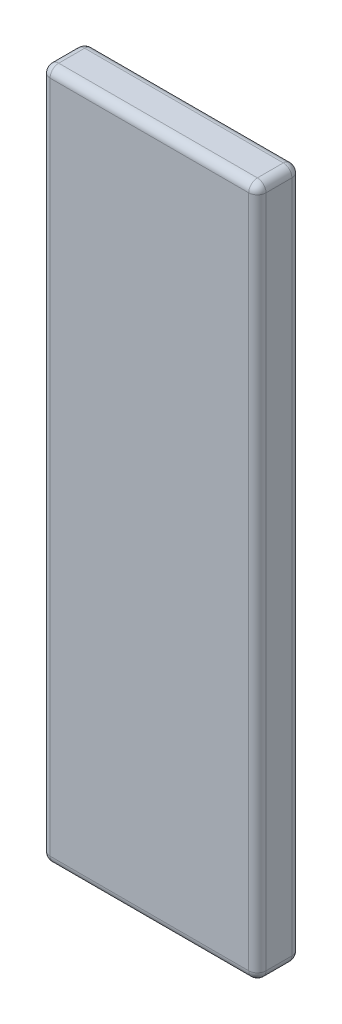
ISO-10303-21;
HEADER;
FILE_DESCRIPTION(('STEP AP214'),'2;1');
FILE_NAME('part.step','',(''),(''),'','','');
FILE_SCHEMA(('AUTOMOTIVE_DESIGN { 1 0 10303 214 1 1 1 1 }'));
ENDSEC;
DATA;
#1=APPLICATION_CONTEXT('core data for automotive mechanical design processes');
#2=APPLICATION_PROTOCOL_DEFINITION('international standard','automotive_design',2000,#1);
#3=PRODUCT_CONTEXT('',#1,'mechanical');
#4=PRODUCT('Part','Part','',(#3));
#5=PRODUCT_RELATED_PRODUCT_CATEGORY('part','',(#4));
#6=PRODUCT_DEFINITION_FORMATION('','',#4);
#7=PRODUCT_DEFINITION_CONTEXT('part definition',#1,'design');
#8=PRODUCT_DEFINITION('design','',#6,#7);
#9=PRODUCT_DEFINITION_SHAPE('','',#8);
#10=(LENGTH_UNIT() NAMED_UNIT(*) SI_UNIT(.MILLI.,.METRE.));
#11=(NAMED_UNIT(*) PLANE_ANGLE_UNIT() SI_UNIT($,.RADIAN.));
#12=(NAMED_UNIT(*) SI_UNIT($,.STERADIAN.) SOLID_ANGLE_UNIT());
#13=UNCERTAINTY_MEASURE_WITH_UNIT(LENGTH_MEASURE(1.E-05),#10,'distance_accuracy_value','');
#14=(GEOMETRIC_REPRESENTATION_CONTEXT(3) GLOBAL_UNCERTAINTY_ASSIGNED_CONTEXT((#13)) GLOBAL_UNIT_ASSIGNED_CONTEXT((#10,
#11,#12)) REPRESENTATION_CONTEXT('',''));
#15=CARTESIAN_POINT('',(0.,0.,0.));
#16=DIRECTION('',(0.,0.,1.));
#17=DIRECTION('',(1.,0.,0.));
#18=AXIS2_PLACEMENT_3D('',#15,#16,#17);
#19=CARTESIAN_POINT('',(1.25,-4.,0.5));
#20=DIRECTION('',(-1.,0.,0.));
#21=DIRECTION('',(0.,0.,1.));
#22=AXIS2_PLACEMENT_3D('',#19,#20,#21);
#23=PLANE('',#22);
#24=DIRECTION('',(0.,1.,0.));
#25=VECTOR('',#24,1.);
#26=CARTESIAN_POINT('',(1.25,-4.,0.4));
#27=LINE('',#26,#25);
#28=CARTESIAN_POINT('',(1.25,3.9,0.4));
#29=VERTEX_POINT('',#28);
#30=CARTESIAN_POINT('',(1.25,-3.9,0.4));
#31=VERTEX_POINT('',#30);
#32=EDGE_CURVE('E187',#29,#31,#27,.F.);
#33=ORIENTED_EDGE('',*,*,#32,.T.);
#34=DIRECTION('',(0.,0.,-1.));
#35=VECTOR('',#34,1.);
#36=CARTESIAN_POINT('',(1.25,-3.9,0.5));
#37=LINE('',#36,#35);
#38=CARTESIAN_POINT('',(1.25,-3.9,0.1));
#39=VERTEX_POINT('',#38);
#40=EDGE_CURVE('E189',#31,#39,#37,.T.);
#41=ORIENTED_EDGE('',*,*,#40,.T.);
#42=DIRECTION('',(0.,1.,0.));
#43=VECTOR('',#42,1.);
#44=CARTESIAN_POINT('',(1.25,4.,0.1));
#45=LINE('',#44,#43);
#46=CARTESIAN_POINT('',(1.25,3.9,0.1));
#47=VERTEX_POINT('',#46);
#48=EDGE_CURVE('E183',#39,#47,#45,.T.);
#49=ORIENTED_EDGE('',*,*,#48,.T.);
#50=DIRECTION('',(0.,0.,-1.));
#51=VECTOR('',#50,1.);
#52=CARTESIAN_POINT('',(1.25,3.9,0.5));
#53=LINE('',#52,#51);
#54=EDGE_CURVE('E185',#47,#29,#53,.F.);
#55=ORIENTED_EDGE('',*,*,#54,.T.);
#56=EDGE_LOOP('',(#33,#41,#49,#55));
#57=FACE_BOUND('',#56,.T.);
#58=ADVANCED_FACE('F32',(#57),#23,.F.);
#59=CARTESIAN_POINT('',(-1.25,4.,0.5));
#60=DIRECTION('',(0.,-1.,0.));
#61=DIRECTION('',(0.,0.,-1.));
#62=AXIS2_PLACEMENT_3D('',#59,#60,#61);
#63=PLANE('',#62);
#64=DIRECTION('',(0.,0.,-1.));
#65=VECTOR('',#64,1.);
#66=CARTESIAN_POINT('',(-1.15,4.,0.5));
#67=LINE('',#66,#65);
#68=CARTESIAN_POINT('',(-1.15,4.,0.1));
#69=VERTEX_POINT('',#68);
#70=CARTESIAN_POINT('',(-1.15,4.,0.4));
#71=VERTEX_POINT('',#70);
#72=EDGE_CURVE('E178',#69,#71,#67,.F.);
#73=ORIENTED_EDGE('',*,*,#72,.T.);
#74=DIRECTION('',(-1.,0.,0.));
#75=VECTOR('',#74,1.);
#76=CARTESIAN_POINT('',(-1.25,4.,0.4));
#77=LINE('',#76,#75);
#78=CARTESIAN_POINT('',(1.15,4.,0.4));
#79=VERTEX_POINT('',#78);
#80=EDGE_CURVE('E180',#71,#79,#77,.F.);
#81=ORIENTED_EDGE('',*,*,#80,.T.);
#82=DIRECTION('',(0.,0.,-1.));
#83=VECTOR('',#82,1.);
#84=CARTESIAN_POINT('',(1.15,4.,0.5));
#85=LINE('',#84,#83);
#86=CARTESIAN_POINT('',(1.15,4.,0.1));
#87=VERTEX_POINT('',#86);
#88=EDGE_CURVE('E176',#79,#87,#85,.T.);
#89=ORIENTED_EDGE('',*,*,#88,.T.);
#90=DIRECTION('',(-1.,0.,0.));
#91=VECTOR('',#90,1.);
#92=CARTESIAN_POINT('',(-1.25,4.,0.1));
#93=LINE('',#92,#91);
#94=EDGE_CURVE('E174',#87,#69,#93,.T.);
#95=ORIENTED_EDGE('',*,*,#94,.T.);
#96=EDGE_LOOP('',(#73,#81,#89,#95));
#97=FACE_BOUND('',#96,.T.);
#98=ADVANCED_FACE('F264',(#97),#63,.F.);
#99=CARTESIAN_POINT('',(-1.25,-4.,0.5));
#100=DIRECTION('',(1.,0.,0.));
#101=DIRECTION('',(0.,0.,-1.));
#102=AXIS2_PLACEMENT_3D('',#99,#100,#101);
#103=PLANE('',#102);
#104=DIRECTION('',(0.,-1.,0.));
#105=VECTOR('',#104,1.);
#106=CARTESIAN_POINT('',(-1.25,-4.,0.1));
#107=LINE('',#106,#105);
#108=CARTESIAN_POINT('',(-1.25,3.9,0.1));
#109=VERTEX_POINT('',#108);
#110=CARTESIAN_POINT('',(-1.25,-3.9,0.1));
#111=VERTEX_POINT('',#110);
#112=EDGE_CURVE('E154',#109,#111,#107,.T.);
#113=ORIENTED_EDGE('',*,*,#112,.T.);
#114=DIRECTION('',(0.,0.,-1.));
#115=VECTOR('',#114,1.);
#116=CARTESIAN_POINT('',(-1.25,-3.9,0.5));
#117=LINE('',#116,#115);
#118=CARTESIAN_POINT('',(-1.25,-3.9,0.4));
#119=VERTEX_POINT('',#118);
#120=EDGE_CURVE('E127',#111,#119,#117,.F.);
#121=ORIENTED_EDGE('',*,*,#120,.T.);
#122=DIRECTION('',(0.,-1.,0.));
#123=VECTOR('',#122,1.);
#124=CARTESIAN_POINT('',(-1.25,-4.,0.4));
#125=LINE('',#124,#123);
#126=CARTESIAN_POINT('',(-1.25,3.9,0.4));
#127=VERTEX_POINT('',#126);
#128=EDGE_CURVE('E162',#119,#127,#125,.F.);
#129=ORIENTED_EDGE('',*,*,#128,.T.);
#130=DIRECTION('',(0.,0.,-1.));
#131=VECTOR('',#130,1.);
#132=CARTESIAN_POINT('',(-1.25,3.9,0.5));
#133=LINE('',#132,#131);
#134=EDGE_CURVE('E156',#127,#109,#133,.T.);
#135=ORIENTED_EDGE('',*,*,#134,.T.);
#136=EDGE_LOOP('',(#113,#121,#129,#135));
#137=FACE_BOUND('',#136,.T.);
#138=ADVANCED_FACE('F325',(#137),#103,.F.);
#139=CARTESIAN_POINT('',(-1.25,-4.,0.5));
#140=DIRECTION('',(0.,1.,0.));
#141=DIRECTION('',(0.,0.,1.));
#142=AXIS2_PLACEMENT_3D('',#139,#140,#141);
#143=PLANE('',#142);
#144=DIRECTION('',(1.,0.,0.));
#145=VECTOR('',#144,1.);
#146=CARTESIAN_POINT('',(-1.25,-4.,0.4));
#147=LINE('',#146,#145);
#148=CARTESIAN_POINT('',(1.15,-4.,0.4));
#149=VERTEX_POINT('',#148);
#150=CARTESIAN_POINT('',(-1.15,-4.,0.4));
#151=VERTEX_POINT('',#150);
#152=EDGE_CURVE('E152',#149,#151,#147,.F.);
#153=ORIENTED_EDGE('',*,*,#152,.T.);
#154=DIRECTION('',(0.,0.,-1.));
#155=VECTOR('',#154,1.);
#156=CARTESIAN_POINT('',(-1.15,-4.,0.5));
#157=LINE('',#156,#155);
#158=CARTESIAN_POINT('',(-1.15,-4.,0.1));
#159=VERTEX_POINT('',#158);
#160=EDGE_CURVE('E125',#151,#159,#157,.T.);
#161=ORIENTED_EDGE('',*,*,#160,.T.);
#162=DIRECTION('',(1.,0.,0.));
#163=VECTOR('',#162,1.);
#164=CARTESIAN_POINT('',(1.25,-4.,0.1));
#165=LINE('',#164,#163);
#166=CARTESIAN_POINT('',(1.15,-4.,0.1));
#167=VERTEX_POINT('',#166);
#168=EDGE_CURVE('E142',#159,#167,#165,.T.);
#169=ORIENTED_EDGE('',*,*,#168,.T.);
#170=DIRECTION('',(0.,0.,-1.));
#171=VECTOR('',#170,1.);
#172=CARTESIAN_POINT('',(1.15,-4.,0.5));
#173=LINE('',#172,#171);
#174=EDGE_CURVE('E148',#167,#149,#173,.F.);
#175=ORIENTED_EDGE('',*,*,#174,.T.);
#176=EDGE_LOOP('',(#153,#161,#169,#175));
#177=FACE_BOUND('',#176,.T.);
#178=ADVANCED_FACE('F150',(#177),#143,.F.);
#179=CARTESIAN_POINT('',(0.,0.,0.5));
#180=DIRECTION('',(0.,0.,-1.));
#181=DIRECTION('',(-1.,0.,0.));
#182=AXIS2_PLACEMENT_3D('',#179,#180,#181);
#183=PLANE('',#182);
#184=DIRECTION('',(0.,-1.,0.));
#185=VECTOR('',#184,1.);
#186=CARTESIAN_POINT('',(-1.15,0.,0.5));
#187=LINE('',#186,#185);
#188=CARTESIAN_POINT('',(-1.15,3.9,0.5));
#189=VERTEX_POINT('',#188);
#190=CARTESIAN_POINT('',(-1.15,-3.9,0.5));
#191=VERTEX_POINT('',#190);
#192=EDGE_CURVE('E169',#189,#191,#187,.T.);
#193=ORIENTED_EDGE('',*,*,#192,.T.);
#194=DIRECTION('',(1.,0.,0.));
#195=VECTOR('',#194,1.);
#196=CARTESIAN_POINT('',(0.,-3.9,0.5));
#197=LINE('',#196,#195);
#198=CARTESIAN_POINT('',(1.15,-3.9,0.5));
#199=VERTEX_POINT('',#198);
#200=EDGE_CURVE('E171',#191,#199,#197,.T.);
#201=ORIENTED_EDGE('',*,*,#200,.T.);
#202=DIRECTION('',(0.,1.,0.));
#203=VECTOR('',#202,1.);
#204=CARTESIAN_POINT('',(1.15,0.,0.5));
#205=LINE('',#204,#203);
#206=CARTESIAN_POINT('',(1.15,3.9,0.5));
#207=VERTEX_POINT('',#206);
#208=EDGE_CURVE('E165',#199,#207,#205,.T.);
#209=ORIENTED_EDGE('',*,*,#208,.T.);
#210=DIRECTION('',(-1.,0.,0.));
#211=VECTOR('',#210,1.);
#212=CARTESIAN_POINT('',(0.,3.9,0.5));
#213=LINE('',#212,#211);
#214=EDGE_CURVE('E167',#207,#189,#213,.T.);
#215=ORIENTED_EDGE('',*,*,#214,.T.);
#216=EDGE_LOOP('',(#193,#201,#209,#215));
#217=FACE_BOUND('',#216,.T.);
#218=ADVANCED_FACE('F285',(#217),#183,.F.);
#219=CARTESIAN_POINT('',(0.,0.,0.));
#220=DIRECTION('',(0.,0.,-1.));
#221=DIRECTION('',(-1.,0.,0.));
#222=AXIS2_PLACEMENT_3D('',#219,#220,#221);
#223=PLANE('',#222);
#224=DIRECTION('',(0.,-1.,0.));
#225=VECTOR('',#224,1.);
#226=CARTESIAN_POINT('',(-1.15,4.,0.));
#227=LINE('',#226,#225);
#228=CARTESIAN_POINT('',(-1.15,-3.9,0.));
#229=VERTEX_POINT('',#228);
#230=CARTESIAN_POINT('',(-1.15,3.9,0.));
#231=VERTEX_POINT('',#230);
#232=EDGE_CURVE('E41',#229,#231,#227,.F.);
#233=ORIENTED_EDGE('',*,*,#232,.T.);
#234=DIRECTION('',(-1.,0.,0.));
#235=VECTOR('',#234,1.);
#236=CARTESIAN_POINT('',(1.25,3.9,0.));
#237=LINE('',#236,#235);
#238=CARTESIAN_POINT('',(1.15,3.9,0.));
#239=VERTEX_POINT('',#238);
#240=EDGE_CURVE('E11',#231,#239,#237,.F.);
#241=ORIENTED_EDGE('',*,*,#240,.T.);
#242=DIRECTION('',(0.,1.,0.));
#243=VECTOR('',#242,1.);
#244=CARTESIAN_POINT('',(1.15,-4.,0.));
#245=LINE('',#244,#243);
#246=CARTESIAN_POINT('',(1.15,-3.9,0.));
#247=VERTEX_POINT('',#246);
#248=EDGE_CURVE('E192',#239,#247,#245,.F.);
#249=ORIENTED_EDGE('',*,*,#248,.T.);
#250=DIRECTION('',(1.,0.,0.));
#251=VECTOR('',#250,1.);
#252=CARTESIAN_POINT('',(-1.25,-3.9,0.));
#253=LINE('',#252,#251);
#254=EDGE_CURVE('E52',#247,#229,#253,.F.);
#255=ORIENTED_EDGE('',*,*,#254,.T.);
#256=EDGE_LOOP('',(#233,#241,#249,#255));
#257=FACE_BOUND('',#256,.T.);
#258=ADVANCED_FACE('F311',(#257),#223,.T.);
#259=CARTESIAN_POINT('',(1.15,3.9,0.5));
#260=DIRECTION('',(0.,0.,-1.));
#261=DIRECTION('',(-1.,0.,0.));
#262=AXIS2_PLACEMENT_3D('',#259,#260,#261);
#263=CYLINDRICAL_SURFACE('',#262,0.1);
#264=CARTESIAN_POINT('',(1.15,3.9,0.4));
#265=DIRECTION('',(0.,0.,1.));
#266=DIRECTION('',(1.,0.,0.));
#267=AXIS2_PLACEMENT_3D('',#264,#265,#266);
#268=CIRCLE('',#267,0.1);
#269=EDGE_CURVE('E36',#29,#79,#268,.T.);
#270=ORIENTED_EDGE('',*,*,#269,.F.);
#271=ORIENTED_EDGE('',*,*,#54,.F.);
#272=CARTESIAN_POINT('',(1.15,3.9,0.1));
#273=DIRECTION('',(0.,0.,-1.));
#274=DIRECTION('',(-1.,0.,0.));
#275=AXIS2_PLACEMENT_3D('',#272,#273,#274);
#276=CIRCLE('',#275,0.1);
#277=EDGE_CURVE('E245',#87,#47,#276,.T.);
#278=ORIENTED_EDGE('',*,*,#277,.F.);
#279=ORIENTED_EDGE('',*,*,#88,.F.);
#280=EDGE_LOOP('',(#270,#271,#278,#279));
#281=FACE_BOUND('',#280,.T.);
#282=ADVANCED_FACE('F34',(#281),#263,.T.);
#283=CARTESIAN_POINT('',(1.15,3.9,0.4));
#284=DIRECTION('',(0.,0.,1.));
#285=DIRECTION('',(1.,0.,0.));
#286=AXIS2_PLACEMENT_3D('',#283,#284,#285);
#287=SPHERICAL_SURFACE('',#286,0.1);
#288=CARTESIAN_POINT('',(1.15,3.9,0.4));
#289=DIRECTION('',(0.,1.,0.));
#290=DIRECTION('',(0.,0.,1.));
#291=AXIS2_PLACEMENT_3D('',#288,#289,#290);
#292=CIRCLE('',#291,0.1);
#293=EDGE_CURVE('E241',#29,#207,#292,.F.);
#294=ORIENTED_EDGE('',*,*,#293,.F.);
#295=ORIENTED_EDGE('',*,*,#269,.T.);
#296=CARTESIAN_POINT('',(1.15,3.9,0.4));
#297=DIRECTION('',(1.,0.,0.));
#298=DIRECTION('',(0.,0.,-1.));
#299=AXIS2_PLACEMENT_3D('',#296,#297,#298);
#300=CIRCLE('',#299,0.1);
#301=EDGE_CURVE('E244',#207,#79,#300,.F.);
#302=ORIENTED_EDGE('',*,*,#301,.F.);
#303=EDGE_LOOP('',(#294,#295,#302));
#304=FACE_BOUND('',#303,.T.);
#305=ADVANCED_FACE('F257',(#304),#287,.T.);
#306=CARTESIAN_POINT('',(1.15,3.9,0.1));
#307=DIRECTION('',(0.,0.,1.));
#308=DIRECTION('',(1.,0.,0.));
#309=AXIS2_PLACEMENT_3D('',#306,#307,#308);
#310=SPHERICAL_SURFACE('',#309,0.1);
#311=CARTESIAN_POINT('',(1.15,3.9,0.1));
#312=DIRECTION('',(1.,0.,0.));
#313=DIRECTION('',(0.,1.,0.));
#314=AXIS2_PLACEMENT_3D('',#311,#312,#313);
#315=CIRCLE('',#314,0.1);
#316=EDGE_CURVE('E235',#87,#239,#315,.F.);
#317=ORIENTED_EDGE('',*,*,#316,.F.);
#318=ORIENTED_EDGE('',*,*,#277,.T.);
#319=CARTESIAN_POINT('',(1.15,3.9,0.1));
#320=DIRECTION('',(0.,1.,0.));
#321=DIRECTION('',(0.,0.,1.));
#322=AXIS2_PLACEMENT_3D('',#319,#320,#321);
#323=CIRCLE('',#322,0.1);
#324=EDGE_CURVE('E238',#239,#47,#323,.F.);
#325=ORIENTED_EDGE('',*,*,#324,.F.);
#326=EDGE_LOOP('',(#317,#318,#325));
#327=FACE_BOUND('',#326,.T.);
#328=ADVANCED_FACE('F307',(#327),#310,.T.);
#329=CARTESIAN_POINT('',(0.,3.9,0.4));
#330=DIRECTION('',(-1.,0.,0.));
#331=DIRECTION('',(0.,0.,1.));
#332=AXIS2_PLACEMENT_3D('',#329,#330,#331);
#333=CYLINDRICAL_SURFACE('',#332,0.1);
#334=ORIENTED_EDGE('',*,*,#301,.T.);
#335=ORIENTED_EDGE('',*,*,#80,.F.);
#336=CARTESIAN_POINT('',(-1.15,3.9,0.4));
#337=DIRECTION('',(-1.,0.,0.));
#338=DIRECTION('',(0.,0.,1.));
#339=AXIS2_PLACEMENT_3D('',#336,#337,#338);
#340=CIRCLE('',#339,0.1);
#341=EDGE_CURVE('E229',#189,#71,#340,.T.);
#342=ORIENTED_EDGE('',*,*,#341,.F.);
#343=ORIENTED_EDGE('',*,*,#214,.F.);
#344=EDGE_LOOP('',(#334,#335,#342,#343));
#345=FACE_BOUND('',#344,.T.);
#346=ADVANCED_FACE('F269',(#345),#333,.T.);
#347=CARTESIAN_POINT('',(1.15,0.,0.4));
#348=DIRECTION('',(0.,1.,0.));
#349=DIRECTION('',(0.,0.,1.));
#350=AXIS2_PLACEMENT_3D('',#347,#348,#349);
#351=CYLINDRICAL_SURFACE('',#350,0.1);
#352=ORIENTED_EDGE('',*,*,#293,.T.);
#353=ORIENTED_EDGE('',*,*,#208,.F.);
#354=CARTESIAN_POINT('',(1.15,-3.9,0.4));
#355=DIRECTION('',(0.,-1.,0.));
#356=DIRECTION('',(0.,0.,-1.));
#357=AXIS2_PLACEMENT_3D('',#354,#355,#356);
#358=CIRCLE('',#357,0.1);
#359=EDGE_CURVE('E226',#31,#199,#358,.T.);
#360=ORIENTED_EDGE('',*,*,#359,.F.);
#361=ORIENTED_EDGE('',*,*,#32,.F.);
#362=EDGE_LOOP('',(#352,#353,#360,#361));
#363=FACE_BOUND('',#362,.T.);
#364=ADVANCED_FACE('F296',(#363),#351,.T.);
#365=CARTESIAN_POINT('',(1.15,-3.9,0.5));
#366=DIRECTION('',(0.,0.,-1.));
#367=DIRECTION('',(-1.,0.,0.));
#368=AXIS2_PLACEMENT_3D('',#365,#366,#367);
#369=CYLINDRICAL_SURFACE('',#368,0.1);
#370=CARTESIAN_POINT('',(1.15,-3.9,0.1));
#371=DIRECTION('',(0.,0.,-1.));
#372=DIRECTION('',(-1.,0.,0.));
#373=AXIS2_PLACEMENT_3D('',#370,#371,#372);
#374=CIRCLE('',#373,0.1);
#375=EDGE_CURVE('E220',#39,#167,#374,.T.);
#376=ORIENTED_EDGE('',*,*,#375,.F.);
#377=ORIENTED_EDGE('',*,*,#40,.F.);
#378=CARTESIAN_POINT('',(1.15,-3.9,0.4));
#379=DIRECTION('',(0.,0.,1.));
#380=DIRECTION('',(1.,0.,0.));
#381=AXIS2_PLACEMENT_3D('',#378,#379,#380);
#382=CIRCLE('',#381,0.1);
#383=EDGE_CURVE('E223',#149,#31,#382,.T.);
#384=ORIENTED_EDGE('',*,*,#383,.F.);
#385=ORIENTED_EDGE('',*,*,#174,.F.);
#386=EDGE_LOOP('',(#376,#377,#384,#385));
#387=FACE_BOUND('',#386,.T.);
#388=ADVANCED_FACE('F301',(#387),#369,.T.);
#389=CARTESIAN_POINT('',(1.15,-4.,0.1));
#390=DIRECTION('',(0.,-1.,0.));
#391=DIRECTION('',(0.,0.,-1.));
#392=AXIS2_PLACEMENT_3D('',#389,#390,#391);
#393=CYLINDRICAL_SURFACE('',#392,0.1);
#394=ORIENTED_EDGE('',*,*,#324,.T.);
#395=ORIENTED_EDGE('',*,*,#48,.F.);
#396=CARTESIAN_POINT('',(1.15,-3.9,0.1));
#397=DIRECTION('',(0.,-1.,0.));
#398=DIRECTION('',(0.,0.,-1.));
#399=AXIS2_PLACEMENT_3D('',#396,#397,#398);
#400=CIRCLE('',#399,0.1);
#401=EDGE_CURVE('E218',#247,#39,#400,.T.);
#402=ORIENTED_EDGE('',*,*,#401,.F.);
#403=ORIENTED_EDGE('',*,*,#248,.F.);
#404=EDGE_LOOP('',(#394,#395,#402,#403));
#405=FACE_BOUND('',#404,.T.);
#406=ADVANCED_FACE('F306',(#405),#393,.T.);
#407=CARTESIAN_POINT('',(-1.25,3.9,0.1));
#408=DIRECTION('',(1.,0.,0.));
#409=DIRECTION('',(0.,0.,-1.));
#410=AXIS2_PLACEMENT_3D('',#407,#408,#409);
#411=CYLINDRICAL_SURFACE('',#410,0.1);
#412=ORIENTED_EDGE('',*,*,#316,.T.);
#413=ORIENTED_EDGE('',*,*,#240,.F.);
#414=CARTESIAN_POINT('',(-1.15,3.9,0.1));
#415=DIRECTION('',(-1.,0.,0.));
#416=DIRECTION('',(0.,0.,1.));
#417=AXIS2_PLACEMENT_3D('',#414,#415,#416);
#418=CIRCLE('',#417,0.1);
#419=EDGE_CURVE('E215',#69,#231,#418,.T.);
#420=ORIENTED_EDGE('',*,*,#419,.F.);
#421=ORIENTED_EDGE('',*,*,#94,.F.);
#422=EDGE_LOOP('',(#412,#413,#420,#421));
#423=FACE_BOUND('',#422,.T.);
#424=ADVANCED_FACE('F310',(#423),#411,.T.);
#425=CARTESIAN_POINT('',(-1.15,3.9,0.5));
#426=DIRECTION('',(0.,0.,-1.));
#427=DIRECTION('',(-1.,0.,0.));
#428=AXIS2_PLACEMENT_3D('',#425,#426,#427);
#429=CYLINDRICAL_SURFACE('',#428,0.1);
#430=CARTESIAN_POINT('',(-1.15,3.9,0.4));
#431=DIRECTION('',(0.,0.,1.));
#432=DIRECTION('',(1.,0.,0.));
#433=AXIS2_PLACEMENT_3D('',#430,#431,#432);
#434=CIRCLE('',#433,0.1);
#435=EDGE_CURVE('E232',#71,#127,#434,.T.);
#436=ORIENTED_EDGE('',*,*,#435,.F.);
#437=ORIENTED_EDGE('',*,*,#72,.F.);
#438=CARTESIAN_POINT('',(-1.15,3.9,0.1));
#439=DIRECTION('',(0.,0.,-1.));
#440=DIRECTION('',(-1.,0.,0.));
#441=AXIS2_PLACEMENT_3D('',#438,#439,#440);
#442=CIRCLE('',#441,0.1);
#443=EDGE_CURVE('E212',#109,#69,#442,.T.);
#444=ORIENTED_EDGE('',*,*,#443,.F.);
#445=ORIENTED_EDGE('',*,*,#134,.F.);
#446=EDGE_LOOP('',(#436,#437,#444,#445));
#447=FACE_BOUND('',#446,.T.);
#448=ADVANCED_FACE('F273',(#447),#429,.T.);
#449=CARTESIAN_POINT('',(-1.15,3.9,0.4));
#450=DIRECTION('',(0.,0.,1.));
#451=DIRECTION('',(1.,0.,0.));
#452=AXIS2_PLACEMENT_3D('',#449,#450,#451);
#453=SPHERICAL_SURFACE('',#452,0.1);
#454=ORIENTED_EDGE('',*,*,#341,.T.);
#455=ORIENTED_EDGE('',*,*,#435,.T.);
#456=CARTESIAN_POINT('',(-1.15,3.9,0.4));
#457=DIRECTION('',(0.,1.,0.));
#458=DIRECTION('',(0.,0.,1.));
#459=AXIS2_PLACEMENT_3D('',#456,#457,#458);
#460=CIRCLE('',#459,0.1);
#461=EDGE_CURVE('E209',#189,#127,#460,.F.);
#462=ORIENTED_EDGE('',*,*,#461,.F.);
#463=EDGE_LOOP('',(#454,#455,#462));
#464=FACE_BOUND('',#463,.T.);
#465=ADVANCED_FACE('F277',(#464),#453,.T.);
#466=CARTESIAN_POINT('',(1.15,-3.9,0.4));
#467=DIRECTION('',(0.,0.,1.));
#468=DIRECTION('',(1.,0.,0.));
#469=AXIS2_PLACEMENT_3D('',#466,#467,#468);
#470=SPHERICAL_SURFACE('',#469,0.1);
#471=ORIENTED_EDGE('',*,*,#383,.T.);
#472=ORIENTED_EDGE('',*,*,#359,.T.);
#473=CARTESIAN_POINT('',(1.15,-3.9,0.4));
#474=DIRECTION('',(1.,0.,0.));
#475=DIRECTION('',(0.,0.,-1.));
#476=AXIS2_PLACEMENT_3D('',#473,#474,#475);
#477=CIRCLE('',#476,0.1);
#478=EDGE_CURVE('E207',#149,#199,#477,.F.);
#479=ORIENTED_EDGE('',*,*,#478,.F.);
#480=EDGE_LOOP('',(#471,#472,#479));
#481=FACE_BOUND('',#480,.T.);
#482=ADVANCED_FACE('F293',(#481),#470,.T.);
#483=CARTESIAN_POINT('',(1.15,-3.9,0.1));
#484=DIRECTION('',(0.,0.,1.));
#485=DIRECTION('',(1.,0.,0.));
#486=AXIS2_PLACEMENT_3D('',#483,#484,#485);
#487=SPHERICAL_SURFACE('',#486,0.1);
#488=ORIENTED_EDGE('',*,*,#401,.T.);
#489=ORIENTED_EDGE('',*,*,#375,.T.);
#490=CARTESIAN_POINT('',(1.15,-3.9,0.1));
#491=DIRECTION('',(1.,0.,0.));
#492=DIRECTION('',(0.,0.,-1.));
#493=AXIS2_PLACEMENT_3D('',#490,#491,#492);
#494=CIRCLE('',#493,0.1);
#495=EDGE_CURVE('E145',#247,#167,#494,.F.);
#496=ORIENTED_EDGE('',*,*,#495,.F.);
#497=EDGE_LOOP('',(#488,#489,#496));
#498=FACE_BOUND('',#497,.T.);
#499=ADVANCED_FACE('F350',(#498),#487,.T.);
#500=CARTESIAN_POINT('',(-1.15,3.9,0.1));
#501=DIRECTION('',(0.,0.,1.));
#502=DIRECTION('',(1.,0.,0.));
#503=AXIS2_PLACEMENT_3D('',#500,#501,#502);
#504=SPHERICAL_SURFACE('',#503,0.1);
#505=ORIENTED_EDGE('',*,*,#443,.T.);
#506=ORIENTED_EDGE('',*,*,#419,.T.);
#507=CARTESIAN_POINT('',(-1.15,3.9,0.1));
#508=DIRECTION('',(0.,1.,0.));
#509=DIRECTION('',(-1.,0.,0.));
#510=AXIS2_PLACEMENT_3D('',#507,#508,#509);
#511=CIRCLE('',#510,0.1);
#512=EDGE_CURVE('E203',#109,#231,#511,.F.);
#513=ORIENTED_EDGE('',*,*,#512,.F.);
#514=EDGE_LOOP('',(#505,#506,#513));
#515=FACE_BOUND('',#514,.T.);
#516=ADVANCED_FACE('F347',(#515),#504,.T.);
#517=CARTESIAN_POINT('',(-1.15,0.,0.4));
#518=DIRECTION('',(0.,-1.,0.));
#519=DIRECTION('',(0.,0.,-1.));
#520=AXIS2_PLACEMENT_3D('',#517,#518,#519);
#521=CYLINDRICAL_SURFACE('',#520,0.1);
#522=ORIENTED_EDGE('',*,*,#461,.T.);
#523=ORIENTED_EDGE('',*,*,#128,.F.);
#524=CARTESIAN_POINT('',(-1.15,-3.9,0.4));
#525=DIRECTION('',(0.,-1.,0.));
#526=DIRECTION('',(0.,0.,-1.));
#527=AXIS2_PLACEMENT_3D('',#524,#525,#526);
#528=CIRCLE('',#527,0.1);
#529=EDGE_CURVE('E200',#191,#119,#528,.T.);
#530=ORIENTED_EDGE('',*,*,#529,.F.);
#531=ORIENTED_EDGE('',*,*,#192,.F.);
#532=EDGE_LOOP('',(#522,#523,#530,#531));
#533=FACE_BOUND('',#532,.T.);
#534=ADVANCED_FACE('F282',(#533),#521,.T.);
#535=CARTESIAN_POINT('',(0.,-3.9,0.4));
#536=DIRECTION('',(1.,0.,0.));
#537=DIRECTION('',(0.,0.,-1.));
#538=AXIS2_PLACEMENT_3D('',#535,#536,#537);
#539=CYLINDRICAL_SURFACE('',#538,0.1);
#540=ORIENTED_EDGE('',*,*,#478,.T.);
#541=ORIENTED_EDGE('',*,*,#200,.F.);
#542=CARTESIAN_POINT('',(-1.15,-3.9,0.4));
#543=DIRECTION('',(-1.,0.,0.));
#544=DIRECTION('',(0.,0.,1.));
#545=AXIS2_PLACEMENT_3D('',#542,#543,#544);
#546=CIRCLE('',#545,0.1);
#547=EDGE_CURVE('E139',#151,#191,#546,.T.);
#548=ORIENTED_EDGE('',*,*,#547,.F.);
#549=ORIENTED_EDGE('',*,*,#152,.F.);
#550=EDGE_LOOP('',(#540,#541,#548,#549));
#551=FACE_BOUND('',#550,.T.);
#552=ADVANCED_FACE('F287',(#551),#539,.T.);
#553=CARTESIAN_POINT('',(-1.25,-3.9,0.1));
#554=DIRECTION('',(-1.,0.,0.));
#555=DIRECTION('',(0.,0.,1.));
#556=AXIS2_PLACEMENT_3D('',#553,#554,#555);
#557=CYLINDRICAL_SURFACE('',#556,0.1);
#558=ORIENTED_EDGE('',*,*,#495,.T.);
#559=ORIENTED_EDGE('',*,*,#168,.F.);
#560=CARTESIAN_POINT('',(-1.15,-3.9,0.1));
#561=DIRECTION('',(-1.,0.,0.));
#562=DIRECTION('',(0.,0.,1.));
#563=AXIS2_PLACEMENT_3D('',#560,#561,#562);
#564=CIRCLE('',#563,0.1);
#565=EDGE_CURVE('E133',#229,#159,#564,.T.);
#566=ORIENTED_EDGE('',*,*,#565,.F.);
#567=ORIENTED_EDGE('',*,*,#254,.F.);
#568=EDGE_LOOP('',(#558,#559,#566,#567));
#569=FACE_BOUND('',#568,.T.);
#570=ADVANCED_FACE('F143',(#569),#557,.T.);
#571=CARTESIAN_POINT('',(-1.15,-4.,0.1));
#572=DIRECTION('',(0.,1.,0.));
#573=DIRECTION('',(0.,0.,1.));
#574=AXIS2_PLACEMENT_3D('',#571,#572,#573);
#575=CYLINDRICAL_SURFACE('',#574,0.1);
#576=ORIENTED_EDGE('',*,*,#512,.T.);
#577=ORIENTED_EDGE('',*,*,#232,.F.);
#578=CARTESIAN_POINT('',(-1.15,-3.9,0.1));
#579=DIRECTION('',(0.,-1.,0.));
#580=DIRECTION('',(0.,0.,-1.));
#581=AXIS2_PLACEMENT_3D('',#578,#579,#580);
#582=CIRCLE('',#581,0.1);
#583=EDGE_CURVE('E137',#111,#229,#582,.T.);
#584=ORIENTED_EDGE('',*,*,#583,.F.);
#585=ORIENTED_EDGE('',*,*,#112,.F.);
#586=EDGE_LOOP('',(#576,#577,#584,#585));
#587=FACE_BOUND('',#586,.T.);
#588=ADVANCED_FACE('F336',(#587),#575,.T.);
#589=CARTESIAN_POINT('',(-1.15,-3.9,0.4));
#590=DIRECTION('',(0.,0.,1.));
#591=DIRECTION('',(1.,0.,0.));
#592=AXIS2_PLACEMENT_3D('',#589,#590,#591);
#593=SPHERICAL_SURFACE('',#592,0.1);
#594=ORIENTED_EDGE('',*,*,#547,.T.);
#595=ORIENTED_EDGE('',*,*,#529,.T.);
#596=CARTESIAN_POINT('',(-1.15,-3.9,0.4));
#597=DIRECTION('',(0.,0.,1.));
#598=DIRECTION('',(1.,0.,0.));
#599=AXIS2_PLACEMENT_3D('',#596,#597,#598);
#600=CIRCLE('',#599,0.1);
#601=EDGE_CURVE('E130',#151,#119,#600,.F.);
#602=ORIENTED_EDGE('',*,*,#601,.F.);
#603=EDGE_LOOP('',(#594,#595,#602));
#604=FACE_BOUND('',#603,.T.);
#605=ADVANCED_FACE('F333',(#604),#593,.T.);
#606=CARTESIAN_POINT('',(-1.15,-3.9,0.1));
#607=DIRECTION('',(0.,0.,1.));
#608=DIRECTION('',(1.,0.,0.));
#609=AXIS2_PLACEMENT_3D('',#606,#607,#608);
#610=SPHERICAL_SURFACE('',#609,0.1);
#611=ORIENTED_EDGE('',*,*,#583,.T.);
#612=ORIENTED_EDGE('',*,*,#565,.T.);
#613=CARTESIAN_POINT('',(-1.15,-3.9,0.1));
#614=DIRECTION('',(0.,0.,-1.));
#615=DIRECTION('',(-1.,0.,0.));
#616=AXIS2_PLACEMENT_3D('',#613,#614,#615);
#617=CIRCLE('',#616,0.1);
#618=EDGE_CURVE('E121',#111,#159,#617,.F.);
#619=ORIENTED_EDGE('',*,*,#618,.F.);
#620=EDGE_LOOP('',(#611,#612,#619));
#621=FACE_BOUND('',#620,.T.);
#622=ADVANCED_FACE('F135',(#621),#610,.T.);
#623=CARTESIAN_POINT('',(-1.15,-3.9,0.5));
#624=DIRECTION('',(0.,0.,-1.));
#625=DIRECTION('',(-1.,0.,0.));
#626=AXIS2_PLACEMENT_3D('',#623,#624,#625);
#627=CYLINDRICAL_SURFACE('',#626,0.1);
#628=ORIENTED_EDGE('',*,*,#601,.T.);
#629=ORIENTED_EDGE('',*,*,#120,.F.);
#630=ORIENTED_EDGE('',*,*,#618,.T.);
#631=ORIENTED_EDGE('',*,*,#160,.F.);
#632=EDGE_LOOP('',(#628,#629,#630,#631));
#633=FACE_BOUND('',#632,.T.);
#634=ADVANCED_FACE('F123',(#633),#627,.T.);
#635=CLOSED_SHELL('',(#58,#98,#138,#178,#218,#258,#282,#305,#328,#346,#364,#388,#406,#424,#448,
#465,#482,#499,#516,#534,#552,#570,#588,#605,#622,#634));
#636=MANIFOLD_SOLID_BREP('B2',#635);
#637=ADVANCED_BREP_SHAPE_REPRESENTATION('',(#18,#636),#14);
#638=SHAPE_DEFINITION_REPRESENTATION(#9,#637);
ENDSEC;
END-ISO-10303-21;
